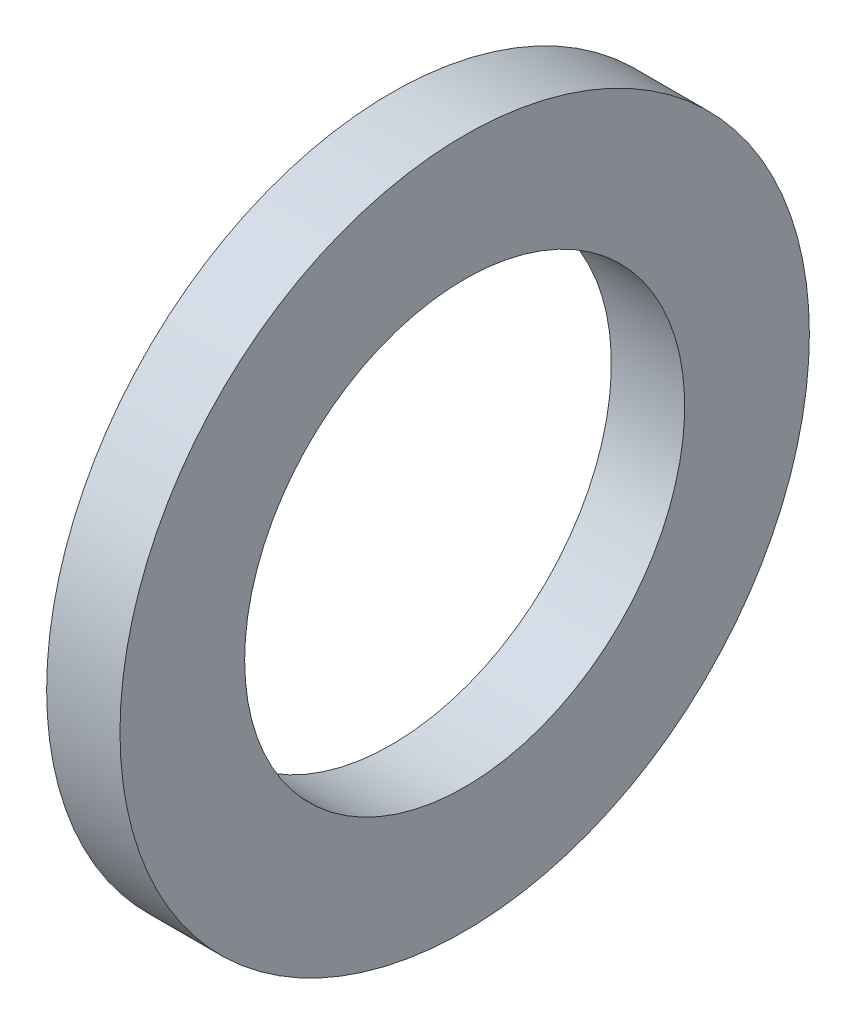
ISO-10303-21;
HEADER;
FILE_DESCRIPTION(('STEP AP214'),'2;1');
FILE_NAME('part.step','',(''),(''),'','','');
FILE_SCHEMA(('AUTOMOTIVE_DESIGN { 1 0 10303 214 1 1 1 1 }'));
ENDSEC;
DATA;
#1=APPLICATION_CONTEXT('core data for automotive mechanical design processes');
#2=APPLICATION_PROTOCOL_DEFINITION('international standard','automotive_design',2000,#1);
#3=PRODUCT_CONTEXT('',#1,'mechanical');
#4=PRODUCT('Part','Part','',(#3));
#5=PRODUCT_RELATED_PRODUCT_CATEGORY('part','',(#4));
#6=PRODUCT_DEFINITION_FORMATION('','',#4);
#7=PRODUCT_DEFINITION_CONTEXT('part definition',#1,'design');
#8=PRODUCT_DEFINITION('design','',#6,#7);
#9=PRODUCT_DEFINITION_SHAPE('','',#8);
#10=(LENGTH_UNIT() NAMED_UNIT(*) SI_UNIT(.MILLI.,.METRE.));
#11=(NAMED_UNIT(*) PLANE_ANGLE_UNIT() SI_UNIT($,.RADIAN.));
#12=(NAMED_UNIT(*) SI_UNIT($,.STERADIAN.) SOLID_ANGLE_UNIT());
#13=UNCERTAINTY_MEASURE_WITH_UNIT(LENGTH_MEASURE(1.E-05),#10,'distance_accuracy_value','');
#14=(GEOMETRIC_REPRESENTATION_CONTEXT(3) GLOBAL_UNCERTAINTY_ASSIGNED_CONTEXT((#13)) GLOBAL_UNIT_ASSIGNED_CONTEXT((#10,
#11,#12)) REPRESENTATION_CONTEXT('',''));
#15=CARTESIAN_POINT('',(0.,0.,0.));
#16=DIRECTION('',(0.,0.,1.));
#17=DIRECTION('',(1.,0.,0.));
#18=AXIS2_PLACEMENT_3D('',#15,#16,#17);
#19=CARTESIAN_POINT('',(-11.5387090475052,-177.242259127471,0.));
#20=DIRECTION('',(1.,0.,0.));
#21=DIRECTION('',(0.,0.,-1.));
#22=AXIS2_PLACEMENT_3D('',#19,#20,#21);
#23=PLANE('',#22);
#24=CARTESIAN_POINT('',(-11.5387090475052,-200.742259127471,0.));
#25=DIRECTION('',(-1.,0.,0.));
#26=DIRECTION('',(0.,0.,1.));
#27=AXIS2_PLACEMENT_3D('',#24,#25,#26);
#28=CIRCLE('',#27,15.);
#29=CARTESIAN_POINT('',(-11.5387090475052,-200.742259127471,15.));
#30=VERTEX_POINT('',#29);
#31=EDGE_CURVE('E10',#30,#30,#28,.T.);
#32=ORIENTED_EDGE('',*,*,#31,.F.);
#33=EDGE_LOOP('',(#32));
#34=FACE_BOUND('',#33,.T.);
#35=CARTESIAN_POINT('',(-11.5387090475052,-200.742259127471,0.));
#36=DIRECTION('',(-1.,0.,0.));
#37=DIRECTION('',(0.,0.,1.));
#38=AXIS2_PLACEMENT_3D('',#35,#36,#37);
#39=CIRCLE('',#38,23.5);
#40=CARTESIAN_POINT('',(-11.5387090475052,-200.742259127471,23.5));
#41=VERTEX_POINT('',#40);
#42=EDGE_CURVE('E49',#41,#41,#39,.T.);
#43=ORIENTED_EDGE('',*,*,#42,.T.);
#44=EDGE_LOOP('',(#43));
#45=FACE_BOUND('',#44,.T.);
#46=ADVANCED_FACE('F35',(#34,#45),#23,.F.);
#47=CARTESIAN_POINT('',(-51.4495482001638,-200.742259127471,0.));
#48=DIRECTION('',(-1.,0.,0.));
#49=DIRECTION('',(0.,0.,1.));
#50=AXIS2_PLACEMENT_3D('',#47,#48,#49);
#51=CYLINDRICAL_SURFACE('',#50,15.);
#52=CARTESIAN_POINT('',(-6.53870904750517,-200.742259127471,0.));
#53=DIRECTION('',(-1.,0.,0.));
#54=DIRECTION('',(0.,0.,1.));
#55=AXIS2_PLACEMENT_3D('',#52,#53,#54);
#56=CIRCLE('',#55,15.);
#57=CARTESIAN_POINT('',(-6.53870904750517,-200.742259127471,15.));
#58=VERTEX_POINT('',#57);
#59=EDGE_CURVE('E41',#58,#58,#56,.T.);
#60=ORIENTED_EDGE('',*,*,#59,.F.);
#61=EDGE_LOOP('',(#60));
#62=FACE_BOUND('',#61,.T.);
#63=ORIENTED_EDGE('',*,*,#31,.T.);
#64=EDGE_LOOP('',(#63));
#65=FACE_BOUND('',#64,.T.);
#66=ADVANCED_FACE('F64',(#62,#65),#51,.F.);
#67=CARTESIAN_POINT('',(-6.53870904750517,-177.242259127471,0.));
#68=DIRECTION('',(-1.,0.,0.));
#69=DIRECTION('',(0.,0.,1.));
#70=AXIS2_PLACEMENT_3D('',#67,#68,#69);
#71=PLANE('',#70);
#72=CARTESIAN_POINT('',(-6.53870904750518,-200.742259127471,0.));
#73=DIRECTION('',(-1.,0.,0.));
#74=DIRECTION('',(0.,0.,1.));
#75=AXIS2_PLACEMENT_3D('',#72,#73,#74);
#76=CIRCLE('',#75,23.5);
#77=CARTESIAN_POINT('',(-6.53870904750518,-200.742259127471,23.5));
#78=VERTEX_POINT('',#77);
#79=EDGE_CURVE('E45',#78,#78,#76,.T.);
#80=ORIENTED_EDGE('',*,*,#79,.F.);
#81=EDGE_LOOP('',(#80));
#82=FACE_BOUND('',#81,.T.);
#83=ORIENTED_EDGE('',*,*,#59,.T.);
#84=EDGE_LOOP('',(#83));
#85=FACE_BOUND('',#84,.T.);
#86=ADVANCED_FACE('F59',(#82,#85),#71,.F.);
#87=CARTESIAN_POINT('',(-51.4495482001638,-200.742259127471,0.));
#88=DIRECTION('',(-1.,0.,0.));
#89=DIRECTION('',(0.,0.,1.));
#90=AXIS2_PLACEMENT_3D('',#87,#88,#89);
#91=CYLINDRICAL_SURFACE('',#90,23.5);
#92=ORIENTED_EDGE('',*,*,#42,.F.);
#93=EDGE_LOOP('',(#92));
#94=FACE_BOUND('',#93,.T.);
#95=ORIENTED_EDGE('',*,*,#79,.T.);
#96=EDGE_LOOP('',(#95));
#97=FACE_BOUND('',#96,.T.);
#98=ADVANCED_FACE('F56',(#94,#97),#91,.T.);
#99=CLOSED_SHELL('',(#46,#66,#86,#98));
#100=MANIFOLD_SOLID_BREP('B2',#99);
#101=ADVANCED_BREP_SHAPE_REPRESENTATION('',(#18,#100),#14);
#102=SHAPE_DEFINITION_REPRESENTATION(#9,#101);
ENDSEC;
END-ISO-10303-21;
